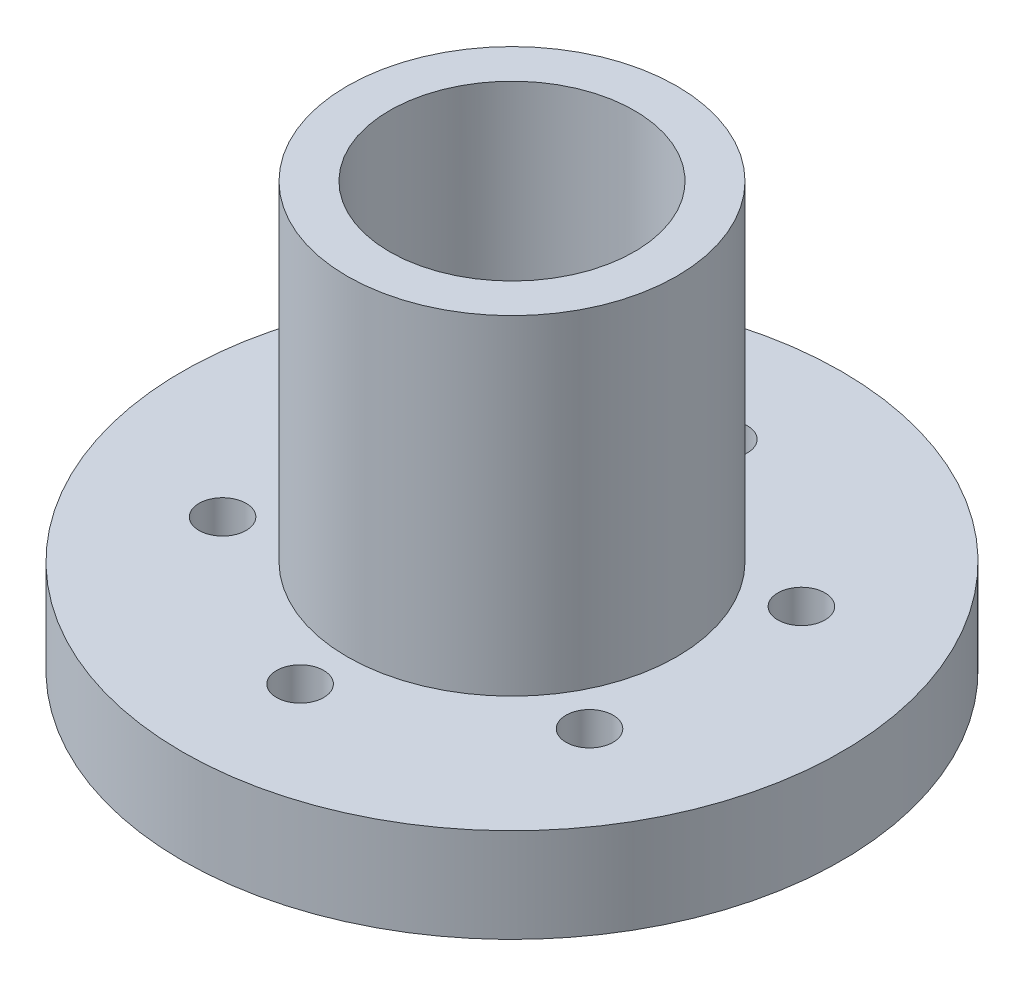
ISO-10303-21;
HEADER;
FILE_DESCRIPTION(('STEP AP214'),'2;1');
FILE_NAME('part.step','',(''),(''),'','','');
FILE_SCHEMA(('AUTOMOTIVE_DESIGN { 1 0 10303 214 1 1 1 1 }'));
ENDSEC;
DATA;
#1=APPLICATION_CONTEXT('core data for automotive mechanical design processes');
#2=APPLICATION_PROTOCOL_DEFINITION('international standard','automotive_design',2000,#1);
#3=PRODUCT_CONTEXT('',#1,'mechanical');
#4=PRODUCT('Part','Part','',(#3));
#5=PRODUCT_RELATED_PRODUCT_CATEGORY('part','',(#4));
#6=PRODUCT_DEFINITION_FORMATION('','',#4);
#7=PRODUCT_DEFINITION_CONTEXT('part definition',#1,'design');
#8=PRODUCT_DEFINITION('design','',#6,#7);
#9=PRODUCT_DEFINITION_SHAPE('','',#8);
#10=(LENGTH_UNIT() NAMED_UNIT(*) SI_UNIT(.MILLI.,.METRE.));
#11=(NAMED_UNIT(*) PLANE_ANGLE_UNIT() SI_UNIT($,.RADIAN.));
#12=(NAMED_UNIT(*) SI_UNIT($,.STERADIAN.) SOLID_ANGLE_UNIT());
#13=UNCERTAINTY_MEASURE_WITH_UNIT(LENGTH_MEASURE(1.E-05),#10,'distance_accuracy_value','');
#14=(GEOMETRIC_REPRESENTATION_CONTEXT(3) GLOBAL_UNCERTAINTY_ASSIGNED_CONTEXT((#13)) GLOBAL_UNIT_ASSIGNED_CONTEXT((#10,
#11,#12)) REPRESENTATION_CONTEXT('',''));
#15=CARTESIAN_POINT('',(0.,0.,0.));
#16=DIRECTION('',(0.,0.,1.));
#17=DIRECTION('',(1.,0.,0.));
#18=AXIS2_PLACEMENT_3D('',#15,#16,#17);
#19=CARTESIAN_POINT('',(0.,10.,0.));
#20=DIRECTION('',(0.,1.,0.));
#21=DIRECTION('',(0.,0.,1.));
#22=AXIS2_PLACEMENT_3D('',#19,#20,#21);
#23=PLANE('',#22);
#24=CARTESIAN_POINT('',(-19.4855715851499,10.,-11.25));
#25=DIRECTION('',(0.,1.,0.));
#26=DIRECTION('',(0.,0.,1.));
#27=AXIS2_PLACEMENT_3D('',#24,#25,#26);
#28=CIRCLE('',#27,2.5);
#29=CARTESIAN_POINT('',(-19.4855715851499,10.,-8.74999999999999));
#30=VERTEX_POINT('',#29);
#31=EDGE_CURVE('E88',#30,#30,#28,.T.);
#32=ORIENTED_EDGE('',*,*,#31,.F.);
#33=EDGE_LOOP('',(#32));
#34=FACE_BOUND('',#33,.T.);
#35=CARTESIAN_POINT('',(0.,10.,22.5));
#36=DIRECTION('',(0.,1.,0.));
#37=DIRECTION('',(0.,0.,1.));
#38=AXIS2_PLACEMENT_3D('',#35,#36,#37);
#39=CIRCLE('',#38,2.5);
#40=CARTESIAN_POINT('',(0.,10.,25.));
#41=VERTEX_POINT('',#40);
#42=EDGE_CURVE('E72',#41,#41,#39,.T.);
#43=ORIENTED_EDGE('',*,*,#42,.F.);
#44=EDGE_LOOP('',(#43));
#45=FACE_BOUND('',#44,.T.);
#46=CARTESIAN_POINT('',(19.4855715851499,10.,-11.25));
#47=DIRECTION('',(0.,1.,0.));
#48=DIRECTION('',(0.,0.,1.));
#49=AXIS2_PLACEMENT_3D('',#46,#47,#48);
#50=CIRCLE('',#49,2.5);
#51=CARTESIAN_POINT('',(19.4855715851499,10.,-8.75000000000001));
#52=VERTEX_POINT('',#51);
#53=EDGE_CURVE('E56',#52,#52,#50,.T.);
#54=ORIENTED_EDGE('',*,*,#53,.F.);
#55=EDGE_LOOP('',(#54));
#56=FACE_BOUND('',#55,.T.);
#57=CARTESIAN_POINT('',(0.,10.,0.));
#58=DIRECTION('',(0.,1.,0.));
#59=DIRECTION('',(0.,0.,1.));
#60=AXIS2_PLACEMENT_3D('',#57,#58,#59);
#61=CIRCLE('',#60,35.);
#62=CARTESIAN_POINT('',(0.,10.,35.));
#63=VERTEX_POINT('',#62);
#64=EDGE_CURVE('E10',#63,#63,#61,.T.);
#65=ORIENTED_EDGE('',*,*,#64,.T.);
#66=EDGE_LOOP('',(#65));
#67=FACE_BOUND('',#66,.T.);
#68=CARTESIAN_POINT('',(0.,10.,-22.5));
#69=DIRECTION('',(0.,1.,0.));
#70=DIRECTION('',(0.,0.,1.));
#71=AXIS2_PLACEMENT_3D('',#68,#69,#70);
#72=CIRCLE('',#71,2.5);
#73=CARTESIAN_POINT('',(0.,10.,-20.));
#74=VERTEX_POINT('',#73);
#75=EDGE_CURVE('E50',#74,#74,#72,.T.);
#76=ORIENTED_EDGE('',*,*,#75,.F.);
#77=EDGE_LOOP('',(#76));
#78=FACE_BOUND('',#77,.T.);
#79=CARTESIAN_POINT('',(19.4855715851499,10.,11.25));
#80=DIRECTION('',(0.,1.,0.));
#81=DIRECTION('',(0.,0.,1.));
#82=AXIS2_PLACEMENT_3D('',#79,#80,#81);
#83=CIRCLE('',#82,2.5);
#84=CARTESIAN_POINT('',(19.4855715851499,10.,13.75));
#85=VERTEX_POINT('',#84);
#86=EDGE_CURVE('E64',#85,#85,#83,.T.);
#87=ORIENTED_EDGE('',*,*,#86,.F.);
#88=EDGE_LOOP('',(#87));
#89=FACE_BOUND('',#88,.T.);
#90=CARTESIAN_POINT('',(-19.4855715851499,10.,11.25));
#91=DIRECTION('',(0.,1.,0.));
#92=DIRECTION('',(0.,0.,1.));
#93=AXIS2_PLACEMENT_3D('',#90,#91,#92);
#94=CIRCLE('',#93,2.5);
#95=CARTESIAN_POINT('',(-19.4855715851499,10.,13.75));
#96=VERTEX_POINT('',#95);
#97=EDGE_CURVE('E80',#96,#96,#94,.T.);
#98=ORIENTED_EDGE('',*,*,#97,.F.);
#99=EDGE_LOOP('',(#98));
#100=FACE_BOUND('',#99,.T.);
#101=CARTESIAN_POINT('',(0.,10.,0.));
#102=DIRECTION('',(0.,1.,0.));
#103=DIRECTION('',(0.,0.,1.));
#104=AXIS2_PLACEMENT_3D('',#101,#102,#103);
#105=CIRCLE('',#104,17.5);
#106=CARTESIAN_POINT('',(0.,10.,17.5));
#107=VERTEX_POINT('',#106);
#108=EDGE_CURVE('E112',#107,#107,#105,.T.);
#109=ORIENTED_EDGE('',*,*,#108,.F.);
#110=EDGE_LOOP('',(#109));
#111=FACE_BOUND('',#110,.T.);
#112=ADVANCED_FACE('F37',(#34,#45,#56,#67,#78,#89,#100,#111),#23,.T.);
#113=CARTESIAN_POINT('',(0.,0.,0.));
#114=DIRECTION('',(0.,1.,0.));
#115=DIRECTION('',(0.,0.,1.));
#116=AXIS2_PLACEMENT_3D('',#113,#114,#115);
#117=PLANE('',#116);
#118=CARTESIAN_POINT('',(0.,0.,0.));
#119=DIRECTION('',(0.,-1.,0.));
#120=DIRECTION('',(0.,0.,-1.));
#121=AXIS2_PLACEMENT_3D('',#118,#119,#120);
#122=CIRCLE('',#121,16.);
#123=CARTESIAN_POINT('',(0.,0.,-16.));
#124=VERTEX_POINT('',#123);
#125=EDGE_CURVE('E100',#124,#124,#122,.T.);
#126=ORIENTED_EDGE('',*,*,#125,.F.);
#127=EDGE_LOOP('',(#126));
#128=FACE_BOUND('',#127,.T.);
#129=CARTESIAN_POINT('',(0.,0.,0.));
#130=DIRECTION('',(0.,1.,0.));
#131=DIRECTION('',(0.,0.,1.));
#132=AXIS2_PLACEMENT_3D('',#129,#130,#131);
#133=CIRCLE('',#132,35.);
#134=CARTESIAN_POINT('',(0.,0.,35.));
#135=VERTEX_POINT('',#134);
#136=EDGE_CURVE('E41',#135,#135,#133,.T.);
#137=ORIENTED_EDGE('',*,*,#136,.F.);
#138=EDGE_LOOP('',(#137));
#139=FACE_BOUND('',#138,.T.);
#140=CARTESIAN_POINT('',(0.,0.,-22.5));
#141=DIRECTION('',(0.,1.,0.));
#142=DIRECTION('',(0.,0.,1.));
#143=AXIS2_PLACEMENT_3D('',#140,#141,#142);
#144=CIRCLE('',#143,2.5);
#145=CARTESIAN_POINT('',(0.,0.,-20.));
#146=VERTEX_POINT('',#145);
#147=EDGE_CURVE('E52',#146,#146,#144,.T.);
#148=ORIENTED_EDGE('',*,*,#147,.T.);
#149=EDGE_LOOP('',(#148));
#150=FACE_BOUND('',#149,.T.);
#151=CARTESIAN_POINT('',(19.4855715851499,0.,-11.25));
#152=DIRECTION('',(0.,1.,0.));
#153=DIRECTION('',(0.,0.,1.));
#154=AXIS2_PLACEMENT_3D('',#151,#152,#153);
#155=CIRCLE('',#154,2.5);
#156=CARTESIAN_POINT('',(19.4855715851499,0.,-8.75000000000001));
#157=VERTEX_POINT('',#156);
#158=EDGE_CURVE('E60',#157,#157,#155,.T.);
#159=ORIENTED_EDGE('',*,*,#158,.T.);
#160=EDGE_LOOP('',(#159));
#161=FACE_BOUND('',#160,.T.);
#162=CARTESIAN_POINT('',(19.4855715851499,0.,11.25));
#163=DIRECTION('',(0.,1.,0.));
#164=DIRECTION('',(0.,0.,1.));
#165=AXIS2_PLACEMENT_3D('',#162,#163,#164);
#166=CIRCLE('',#165,2.5);
#167=CARTESIAN_POINT('',(19.4855715851499,0.,13.75));
#168=VERTEX_POINT('',#167);
#169=EDGE_CURVE('E68',#168,#168,#166,.T.);
#170=ORIENTED_EDGE('',*,*,#169,.T.);
#171=EDGE_LOOP('',(#170));
#172=FACE_BOUND('',#171,.T.);
#173=CARTESIAN_POINT('',(0.,0.,22.5));
#174=DIRECTION('',(0.,1.,0.));
#175=DIRECTION('',(0.,0.,1.));
#176=AXIS2_PLACEMENT_3D('',#173,#174,#175);
#177=CIRCLE('',#176,2.5);
#178=CARTESIAN_POINT('',(0.,0.,25.));
#179=VERTEX_POINT('',#178);
#180=EDGE_CURVE('E76',#179,#179,#177,.T.);
#181=ORIENTED_EDGE('',*,*,#180,.T.);
#182=EDGE_LOOP('',(#181));
#183=FACE_BOUND('',#182,.T.);
#184=CARTESIAN_POINT('',(-19.4855715851499,0.,11.25));
#185=DIRECTION('',(0.,1.,0.));
#186=DIRECTION('',(0.,0.,1.));
#187=AXIS2_PLACEMENT_3D('',#184,#185,#186);
#188=CIRCLE('',#187,2.5);
#189=CARTESIAN_POINT('',(-19.4855715851499,0.,13.75));
#190=VERTEX_POINT('',#189);
#191=EDGE_CURVE('E84',#190,#190,#188,.T.);
#192=ORIENTED_EDGE('',*,*,#191,.T.);
#193=EDGE_LOOP('',(#192));
#194=FACE_BOUND('',#193,.T.);
#195=CARTESIAN_POINT('',(-19.4855715851499,0.,-11.25));
#196=DIRECTION('',(0.,1.,0.));
#197=DIRECTION('',(0.,0.,1.));
#198=AXIS2_PLACEMENT_3D('',#195,#196,#197);
#199=CIRCLE('',#198,2.5);
#200=CARTESIAN_POINT('',(-19.4855715851499,0.,-8.74999999999999));
#201=VERTEX_POINT('',#200);
#202=EDGE_CURVE('E92',#201,#201,#199,.T.);
#203=ORIENTED_EDGE('',*,*,#202,.T.);
#204=EDGE_LOOP('',(#203));
#205=FACE_BOUND('',#204,.T.);
#206=ADVANCED_FACE('F141',(#128,#139,#150,#161,#172,#183,#194,#205),#117,.F.);
#207=CARTESIAN_POINT('',(0.,10.,0.));
#208=DIRECTION('',(0.,-1.,0.));
#209=DIRECTION('',(0.,0.,-1.));
#210=AXIS2_PLACEMENT_3D('',#207,#208,#209);
#211=CYLINDRICAL_SURFACE('',#210,35.);
#212=ORIENTED_EDGE('',*,*,#64,.F.);
#213=EDGE_LOOP('',(#212));
#214=FACE_BOUND('',#213,.T.);
#215=ORIENTED_EDGE('',*,*,#136,.T.);
#216=EDGE_LOOP('',(#215));
#217=FACE_BOUND('',#216,.T.);
#218=ADVANCED_FACE('F39',(#214,#217),#211,.T.);
#219=CARTESIAN_POINT('',(0.,10.,-22.5));
#220=DIRECTION('',(0.,-1.,0.));
#221=DIRECTION('',(0.,0.,-1.));
#222=AXIS2_PLACEMENT_3D('',#219,#220,#221);
#223=CYLINDRICAL_SURFACE('',#222,2.5);
#224=ORIENTED_EDGE('',*,*,#75,.T.);
#225=EDGE_LOOP('',(#224));
#226=FACE_BOUND('',#225,.T.);
#227=ORIENTED_EDGE('',*,*,#147,.F.);
#228=EDGE_LOOP('',(#227));
#229=FACE_BOUND('',#228,.T.);
#230=ADVANCED_FACE('F151',(#226,#229),#223,.F.);
#231=CARTESIAN_POINT('',(19.4855715851499,10.,-11.25));
#232=DIRECTION('',(0.,-1.,0.));
#233=DIRECTION('',(0.,0.,-1.));
#234=AXIS2_PLACEMENT_3D('',#231,#232,#233);
#235=CYLINDRICAL_SURFACE('',#234,2.5);
#236=ORIENTED_EDGE('',*,*,#53,.T.);
#237=EDGE_LOOP('',(#236));
#238=FACE_BOUND('',#237,.T.);
#239=ORIENTED_EDGE('',*,*,#158,.F.);
#240=EDGE_LOOP('',(#239));
#241=FACE_BOUND('',#240,.T.);
#242=ADVANCED_FACE('F154',(#238,#241),#235,.F.);
#243=CARTESIAN_POINT('',(19.4855715851499,10.,11.25));
#244=DIRECTION('',(0.,-1.,0.));
#245=DIRECTION('',(0.,0.,-1.));
#246=AXIS2_PLACEMENT_3D('',#243,#244,#245);
#247=CYLINDRICAL_SURFACE('',#246,2.5);
#248=ORIENTED_EDGE('',*,*,#86,.T.);
#249=EDGE_LOOP('',(#248));
#250=FACE_BOUND('',#249,.T.);
#251=ORIENTED_EDGE('',*,*,#169,.F.);
#252=EDGE_LOOP('',(#251));
#253=FACE_BOUND('',#252,.T.);
#254=ADVANCED_FACE('F158',(#250,#253),#247,.F.);
#255=CARTESIAN_POINT('',(0.,10.,22.5));
#256=DIRECTION('',(0.,-1.,0.));
#257=DIRECTION('',(0.,0.,-1.));
#258=AXIS2_PLACEMENT_3D('',#255,#256,#257);
#259=CYLINDRICAL_SURFACE('',#258,2.5);
#260=ORIENTED_EDGE('',*,*,#42,.T.);
#261=EDGE_LOOP('',(#260));
#262=FACE_BOUND('',#261,.T.);
#263=ORIENTED_EDGE('',*,*,#180,.F.);
#264=EDGE_LOOP('',(#263));
#265=FACE_BOUND('',#264,.T.);
#266=ADVANCED_FACE('F162',(#262,#265),#259,.F.);
#267=CARTESIAN_POINT('',(-19.4855715851499,10.,11.25));
#268=DIRECTION('',(0.,-1.,0.));
#269=DIRECTION('',(0.,0.,-1.));
#270=AXIS2_PLACEMENT_3D('',#267,#268,#269);
#271=CYLINDRICAL_SURFACE('',#270,2.5);
#272=ORIENTED_EDGE('',*,*,#97,.T.);
#273=EDGE_LOOP('',(#272));
#274=FACE_BOUND('',#273,.T.);
#275=ORIENTED_EDGE('',*,*,#191,.F.);
#276=EDGE_LOOP('',(#275));
#277=FACE_BOUND('',#276,.T.);
#278=ADVANCED_FACE('F166',(#274,#277),#271,.F.);
#279=CARTESIAN_POINT('',(-19.4855715851499,10.,-11.25));
#280=DIRECTION('',(0.,-1.,0.));
#281=DIRECTION('',(0.,0.,-1.));
#282=AXIS2_PLACEMENT_3D('',#279,#280,#281);
#283=CYLINDRICAL_SURFACE('',#282,2.5);
#284=ORIENTED_EDGE('',*,*,#31,.T.);
#285=EDGE_LOOP('',(#284));
#286=FACE_BOUND('',#285,.T.);
#287=ORIENTED_EDGE('',*,*,#202,.F.);
#288=EDGE_LOOP('',(#287));
#289=FACE_BOUND('',#288,.T.);
#290=ADVANCED_FACE('F170',(#286,#289),#283,.F.);
#291=CARTESIAN_POINT('',(0.,5.,0.));
#292=DIRECTION('',(0.,-1.,0.));
#293=DIRECTION('',(0.,0.,-1.));
#294=AXIS2_PLACEMENT_3D('',#291,#292,#293);
#295=CYLINDRICAL_SURFACE('',#294,16.);
#296=CARTESIAN_POINT('',(0.,5.,0.));
#297=DIRECTION('',(0.,-1.,0.));
#298=DIRECTION('',(0.,0.,-1.));
#299=AXIS2_PLACEMENT_3D('',#296,#297,#298);
#300=CIRCLE('',#299,16.);
#301=CARTESIAN_POINT('',(0.,5.,-16.));
#302=VERTEX_POINT('',#301);
#303=EDGE_CURVE('E96',#302,#302,#300,.T.);
#304=ORIENTED_EDGE('',*,*,#303,.F.);
#305=EDGE_LOOP('',(#304));
#306=FACE_BOUND('',#305,.T.);
#307=ORIENTED_EDGE('',*,*,#125,.T.);
#308=EDGE_LOOP('',(#307));
#309=FACE_BOUND('',#308,.T.);
#310=ADVANCED_FACE('F174',(#306,#309),#295,.F.);
#311=CARTESIAN_POINT('',(0.,5.,0.));
#312=DIRECTION('',(0.,-1.,0.));
#313=DIRECTION('',(0.,0.,-1.));
#314=AXIS2_PLACEMENT_3D('',#311,#312,#313);
#315=PLANE('',#314);
#316=CARTESIAN_POINT('',(0.,5.,0.));
#317=DIRECTION('',(0.,-1.,0.));
#318=DIRECTION('',(0.,0.,-1.));
#319=AXIS2_PLACEMENT_3D('',#316,#317,#318);
#320=CIRCLE('',#319,13.);
#321=CARTESIAN_POINT('',(0.,5.,-13.));
#322=VERTEX_POINT('',#321);
#323=EDGE_CURVE('E104',#322,#322,#320,.F.);
#324=ORIENTED_EDGE('',*,*,#323,.T.);
#325=EDGE_LOOP('',(#324));
#326=FACE_BOUND('',#325,.T.);
#327=ORIENTED_EDGE('',*,*,#303,.T.);
#328=EDGE_LOOP('',(#327));
#329=FACE_BOUND('',#328,.T.);
#330=ADVANCED_FACE('F137',(#326,#329),#315,.T.);
#331=CARTESIAN_POINT('',(0.,-31.7695526217005,0.));
#332=DIRECTION('',(0.,1.,0.));
#333=DIRECTION('',(0.,0.,1.));
#334=AXIS2_PLACEMENT_3D('',#331,#332,#333);
#335=CYLINDRICAL_SURFACE('',#334,13.);
#336=ORIENTED_EDGE('',*,*,#323,.F.);
#337=EDGE_LOOP('',(#336));
#338=FACE_BOUND('',#337,.T.);
#339=CARTESIAN_POINT('',(0.,45.,0.));
#340=DIRECTION('',(0.,1.,0.));
#341=DIRECTION('',(0.,0.,1.));
#342=AXIS2_PLACEMENT_3D('',#339,#340,#341);
#343=CIRCLE('',#342,13.);
#344=CARTESIAN_POINT('',(0.,45.,13.));
#345=VERTEX_POINT('',#344);
#346=EDGE_CURVE('E116',#345,#345,#343,.T.);
#347=ORIENTED_EDGE('',*,*,#346,.T.);
#348=EDGE_LOOP('',(#347));
#349=FACE_BOUND('',#348,.T.);
#350=ADVANCED_FACE('F124',(#338,#349),#335,.F.);
#351=CARTESIAN_POINT('',(0.,45.,0.));
#352=DIRECTION('',(0.,1.,0.));
#353=DIRECTION('',(0.,0.,1.));
#354=AXIS2_PLACEMENT_3D('',#351,#352,#353);
#355=PLANE('',#354);
#356=CARTESIAN_POINT('',(0.,45.,0.));
#357=DIRECTION('',(0.,1.,0.));
#358=DIRECTION('',(0.,0.,1.));
#359=AXIS2_PLACEMENT_3D('',#356,#357,#358);
#360=CIRCLE('',#359,17.5);
#361=CARTESIAN_POINT('',(0.,45.,17.5));
#362=VERTEX_POINT('',#361);
#363=EDGE_CURVE('E111',#362,#362,#360,.T.);
#364=ORIENTED_EDGE('',*,*,#363,.T.);
#365=EDGE_LOOP('',(#364));
#366=FACE_BOUND('',#365,.T.);
#367=ORIENTED_EDGE('',*,*,#346,.F.);
#368=EDGE_LOOP('',(#367));
#369=FACE_BOUND('',#368,.T.);
#370=ADVANCED_FACE('F126',(#366,#369),#355,.T.);
#371=CARTESIAN_POINT('',(0.,45.,0.));
#372=DIRECTION('',(0.,-1.,0.));
#373=DIRECTION('',(0.,0.,-1.));
#374=AXIS2_PLACEMENT_3D('',#371,#372,#373);
#375=CYLINDRICAL_SURFACE('',#374,17.5);
#376=ORIENTED_EDGE('',*,*,#363,.F.);
#377=EDGE_LOOP('',(#376));
#378=FACE_BOUND('',#377,.T.);
#379=ORIENTED_EDGE('',*,*,#108,.T.);
#380=EDGE_LOOP('',(#379));
#381=FACE_BOUND('',#380,.T.);
#382=ADVANCED_FACE('F128',(#378,#381),#375,.T.);
#383=CLOSED_SHELL('',(#112,#206,#218,#230,#242,#254,#266,#278,#290,#310,#330,#350,#370,#382));
#384=MANIFOLD_SOLID_BREP('B2',#383);
#385=ADVANCED_BREP_SHAPE_REPRESENTATION('',(#18,#384),#14);
#386=SHAPE_DEFINITION_REPRESENTATION(#9,#385);
ENDSEC;
END-ISO-10303-21;
